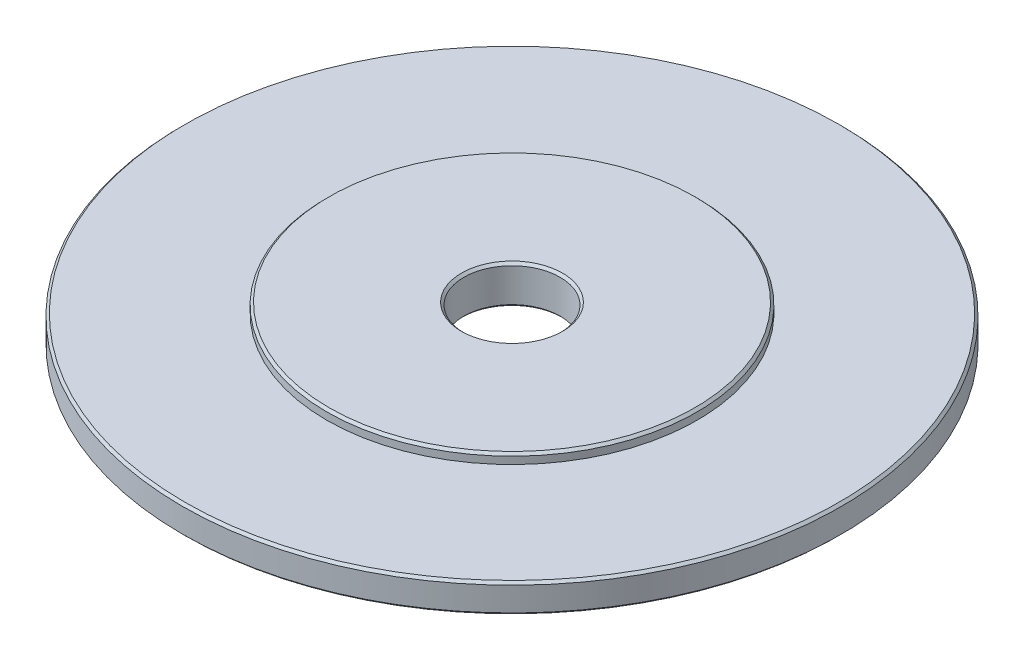
ISO-10303-21;
HEADER;
FILE_DESCRIPTION(('STEP AP214'),'2;1');
FILE_NAME('part.step','',(''),(''),'','','');
FILE_SCHEMA(('AUTOMOTIVE_DESIGN { 1 0 10303 214 1 1 1 1 }'));
ENDSEC;
DATA;
#1=APPLICATION_CONTEXT('core data for automotive mechanical design processes');
#2=APPLICATION_PROTOCOL_DEFINITION('international standard','automotive_design',2000,#1);
#3=PRODUCT_CONTEXT('',#1,'mechanical');
#4=PRODUCT('Part','Part','',(#3));
#5=PRODUCT_RELATED_PRODUCT_CATEGORY('part','',(#4));
#6=PRODUCT_DEFINITION_FORMATION('','',#4);
#7=PRODUCT_DEFINITION_CONTEXT('part definition',#1,'design');
#8=PRODUCT_DEFINITION('design','',#6,#7);
#9=PRODUCT_DEFINITION_SHAPE('','',#8);
#10=(LENGTH_UNIT() NAMED_UNIT(*) SI_UNIT(.MILLI.,.METRE.));
#11=(NAMED_UNIT(*) PLANE_ANGLE_UNIT() SI_UNIT($,.RADIAN.));
#12=(NAMED_UNIT(*) SI_UNIT($,.STERADIAN.) SOLID_ANGLE_UNIT());
#13=UNCERTAINTY_MEASURE_WITH_UNIT(LENGTH_MEASURE(1.E-05),#10,'distance_accuracy_value','');
#14=(GEOMETRIC_REPRESENTATION_CONTEXT(3) GLOBAL_UNCERTAINTY_ASSIGNED_CONTEXT((#13)) GLOBAL_UNIT_ASSIGNED_CONTEXT((#10,
#11,#12)) REPRESENTATION_CONTEXT('',''));
#15=CARTESIAN_POINT('',(0.,0.,0.));
#16=DIRECTION('',(0.,0.,1.));
#17=DIRECTION('',(1.,0.,0.));
#18=AXIS2_PLACEMENT_3D('',#15,#16,#17);
#19=CARTESIAN_POINT('',(0.,0.,0.));
#20=DIRECTION('',(0.,-1.,0.));
#21=DIRECTION('',(0.,0.,-1.));
#22=AXIS2_PLACEMENT_3D('',#19,#20,#21);
#23=CYLINDRICAL_SURFACE('',#22,68.5);
#24=CARTESIAN_POINT('',(0.,0.500000000000014,0.));
#25=DIRECTION('',(0.,-1.,0.));
#26=DIRECTION('',(0.,0.,-1.));
#27=AXIS2_PLACEMENT_3D('',#24,#25,#26);
#28=CIRCLE('',#27,68.5);
#29=CARTESIAN_POINT('',(0.,0.500000000000014,-68.5));
#30=VERTEX_POINT('',#29);
#31=EDGE_CURVE('E58',#30,#30,#28,.F.);
#32=ORIENTED_EDGE('',*,*,#31,.T.);
#33=EDGE_LOOP('',(#32));
#34=FACE_BOUND('',#33,.T.);
#35=CARTESIAN_POINT('',(0.,5.49999999999999,0.));
#36=DIRECTION('',(0.,1.,0.));
#37=DIRECTION('',(0.,0.,1.));
#38=AXIS2_PLACEMENT_3D('',#35,#36,#37);
#39=CIRCLE('',#38,68.5);
#40=CARTESIAN_POINT('',(0.,5.49999999999999,68.5));
#41=VERTEX_POINT('',#40);
#42=EDGE_CURVE('E61',#41,#41,#39,.F.);
#43=ORIENTED_EDGE('',*,*,#42,.T.);
#44=EDGE_LOOP('',(#43));
#45=FACE_BOUND('',#44,.T.);
#46=ADVANCED_FACE('F32',(#34,#45),#23,.T.);
#47=CARTESIAN_POINT('',(0.,5.99999999999999,-68.5));
#48=DIRECTION('',(0.,1.,0.));
#49=DIRECTION('',(0.,0.,1.));
#50=AXIS2_PLACEMENT_3D('',#47,#48,#49);
#51=PLANE('',#50);
#52=CARTESIAN_POINT('',(0.,5.99999999999999,0.));
#53=DIRECTION('',(0.,1.,0.));
#54=DIRECTION('',(0.,0.,1.));
#55=AXIS2_PLACEMENT_3D('',#52,#53,#54);
#56=CIRCLE('',#55,68.);
#57=CARTESIAN_POINT('',(0.,5.99999999999999,68.));
#58=VERTEX_POINT('',#57);
#59=EDGE_CURVE('E55',#58,#58,#56,.T.);
#60=ORIENTED_EDGE('',*,*,#59,.T.);
#61=EDGE_LOOP('',(#60));
#62=FACE_BOUND('',#61,.T.);
#63=CARTESIAN_POINT('',(0.,6.,0.));
#64=DIRECTION('',(0.,-1.,0.));
#65=DIRECTION('',(0.,0.,-1.));
#66=AXIS2_PLACEMENT_3D('',#63,#64,#65);
#67=CIRCLE('',#66,38.5);
#68=CARTESIAN_POINT('',(0.,6.,-38.5));
#69=VERTEX_POINT('',#68);
#70=EDGE_CURVE('E70',#69,#69,#67,.T.);
#71=ORIENTED_EDGE('',*,*,#70,.T.);
#72=EDGE_LOOP('',(#71));
#73=FACE_BOUND('',#72,.T.);
#74=ADVANCED_FACE('F74',(#62,#73),#51,.T.);
#75=CARTESIAN_POINT('',(0.,0.,0.));
#76=DIRECTION('',(0.,-1.,0.));
#77=DIRECTION('',(0.,0.,-1.));
#78=AXIS2_PLACEMENT_3D('',#75,#76,#77);
#79=CYLINDRICAL_SURFACE('',#78,38.5);
#80=CARTESIAN_POINT('',(0.,7.49999999999999,0.));
#81=DIRECTION('',(0.,1.,0.));
#82=DIRECTION('',(0.,0.,1.));
#83=AXIS2_PLACEMENT_3D('',#80,#81,#82);
#84=CIRCLE('',#83,38.5);
#85=CARTESIAN_POINT('',(0.,7.49999999999999,38.5));
#86=VERTEX_POINT('',#85);
#87=EDGE_CURVE('E10',#86,#86,#84,.F.);
#88=ORIENTED_EDGE('',*,*,#87,.T.);
#89=EDGE_LOOP('',(#88));
#90=FACE_BOUND('',#89,.T.);
#91=ORIENTED_EDGE('',*,*,#70,.F.);
#92=EDGE_LOOP('',(#91));
#93=FACE_BOUND('',#92,.T.);
#94=ADVANCED_FACE('F76',(#90,#93),#79,.T.);
#95=CARTESIAN_POINT('',(0.,7.99999999999999,-38.5));
#96=DIRECTION('',(0.,1.,0.));
#97=DIRECTION('',(0.,0.,1.));
#98=AXIS2_PLACEMENT_3D('',#95,#96,#97);
#99=PLANE('',#98);
#100=CARTESIAN_POINT('',(0.,7.99999999999999,0.));
#101=DIRECTION('',(0.,1.,0.));
#102=DIRECTION('',(0.,0.,1.));
#103=AXIS2_PLACEMENT_3D('',#100,#101,#102);
#104=CIRCLE('',#103,10.5);
#105=CARTESIAN_POINT('',(0.,7.99999999999999,10.5));
#106=VERTEX_POINT('',#105);
#107=EDGE_CURVE('E47',#106,#106,#104,.F.);
#108=ORIENTED_EDGE('',*,*,#107,.T.);
#109=EDGE_LOOP('',(#108));
#110=FACE_BOUND('',#109,.T.);
#111=CARTESIAN_POINT('',(0.,7.99999999999999,0.));
#112=DIRECTION('',(0.,1.,0.));
#113=DIRECTION('',(0.,0.,1.));
#114=AXIS2_PLACEMENT_3D('',#111,#112,#113);
#115=CIRCLE('',#114,38.);
#116=CARTESIAN_POINT('',(0.,7.99999999999999,38.));
#117=VERTEX_POINT('',#116);
#118=EDGE_CURVE('E52',#117,#117,#115,.T.);
#119=ORIENTED_EDGE('',*,*,#118,.T.);
#120=EDGE_LOOP('',(#119));
#121=FACE_BOUND('',#120,.T.);
#122=ADVANCED_FACE('F78',(#110,#121),#99,.T.);
#123=CARTESIAN_POINT('',(0.,0.,0.));
#124=DIRECTION('',(0.,-1.,0.));
#125=DIRECTION('',(0.,0.,-1.));
#126=AXIS2_PLACEMENT_3D('',#123,#124,#125);
#127=CYLINDRICAL_SURFACE('',#126,10.);
#128=CARTESIAN_POINT('',(0.,7.49999999999996,0.));
#129=DIRECTION('',(0.,1.,0.));
#130=DIRECTION('',(0.,0.,1.));
#131=AXIS2_PLACEMENT_3D('',#128,#129,#130);
#132=CIRCLE('',#131,10.);
#133=CARTESIAN_POINT('',(0.,7.49999999999996,10.));
#134=VERTEX_POINT('',#133);
#135=EDGE_CURVE('E39',#134,#134,#132,.T.);
#136=ORIENTED_EDGE('',*,*,#135,.T.);
#137=EDGE_LOOP('',(#136));
#138=FACE_BOUND('',#137,.T.);
#139=CARTESIAN_POINT('',(0.,0.49999999999999,0.));
#140=DIRECTION('',(0.,-1.,0.));
#141=DIRECTION('',(0.,0.,-1.));
#142=AXIS2_PLACEMENT_3D('',#139,#140,#141);
#143=CIRCLE('',#142,10.);
#144=CARTESIAN_POINT('',(0.,0.49999999999999,-10.));
#145=VERTEX_POINT('',#144);
#146=EDGE_CURVE('E43',#145,#145,#143,.T.);
#147=ORIENTED_EDGE('',*,*,#146,.T.);
#148=EDGE_LOOP('',(#147));
#149=FACE_BOUND('',#148,.T.);
#150=ADVANCED_FACE('F84',(#138,#149),#127,.F.);
#151=CARTESIAN_POINT('',(0.,0.,-10.));
#152=DIRECTION('',(0.,-1.,0.));
#153=DIRECTION('',(0.,0.,-1.));
#154=AXIS2_PLACEMENT_3D('',#151,#152,#153);
#155=PLANE('',#154);
#156=CARTESIAN_POINT('',(0.,0.,0.));
#157=DIRECTION('',(0.,-1.,0.));
#158=DIRECTION('',(0.,0.,-1.));
#159=AXIS2_PLACEMENT_3D('',#156,#157,#158);
#160=CIRCLE('',#159,68.);
#161=CARTESIAN_POINT('',(0.,0.,-68.));
#162=VERTEX_POINT('',#161);
#163=EDGE_CURVE('E64',#162,#162,#160,.T.);
#164=ORIENTED_EDGE('',*,*,#163,.T.);
#165=EDGE_LOOP('',(#164));
#166=FACE_BOUND('',#165,.T.);
#167=CARTESIAN_POINT('',(0.,0.,0.));
#168=DIRECTION('',(0.,-1.,0.));
#169=DIRECTION('',(0.,0.,-1.));
#170=AXIS2_PLACEMENT_3D('',#167,#168,#169);
#171=CIRCLE('',#170,10.5);
#172=CARTESIAN_POINT('',(0.,0.,-10.5));
#173=VERTEX_POINT('',#172);
#174=EDGE_CURVE('E67',#173,#173,#171,.F.);
#175=ORIENTED_EDGE('',*,*,#174,.T.);
#176=EDGE_LOOP('',(#175));
#177=FACE_BOUND('',#176,.T.);
#178=ADVANCED_FACE('F100',(#166,#177),#155,.T.);
#179=CARTESIAN_POINT('',(0.,0.,0.));
#180=DIRECTION('',(0.,1.,0.));
#181=DIRECTION('',(0.,0.,1.));
#182=AXIS2_PLACEMENT_3D('',#179,#180,#181);
#183=CONICAL_SURFACE('',#182,68.,0.785398163397435);
#184=ORIENTED_EDGE('',*,*,#31,.F.);
#185=EDGE_LOOP('',(#184));
#186=FACE_BOUND('',#185,.T.);
#187=ORIENTED_EDGE('',*,*,#163,.F.);
#188=EDGE_LOOP('',(#187));
#189=FACE_BOUND('',#188,.T.);
#190=ADVANCED_FACE('F96',(#186,#189),#183,.T.);
#191=CARTESIAN_POINT('',(0.,5.49999999999999,0.));
#192=DIRECTION('',(0.,-1.,0.));
#193=DIRECTION('',(0.,0.,-1.));
#194=AXIS2_PLACEMENT_3D('',#191,#192,#193);
#195=CONICAL_SURFACE('',#194,68.5,0.785398163397448);
#196=ORIENTED_EDGE('',*,*,#59,.F.);
#197=EDGE_LOOP('',(#196));
#198=FACE_BOUND('',#197,.T.);
#199=ORIENTED_EDGE('',*,*,#42,.F.);
#200=EDGE_LOOP('',(#199));
#201=FACE_BOUND('',#200,.T.);
#202=ADVANCED_FACE('F99',(#198,#201),#195,.T.);
#203=CARTESIAN_POINT('',(0.,7.99999999999999,0.));
#204=DIRECTION('',(0.,1.,0.));
#205=DIRECTION('',(0.,0.,1.));
#206=AXIS2_PLACEMENT_3D('',#203,#204,#205);
#207=CONICAL_SURFACE('',#206,10.5,0.785398163397455);
#208=ORIENTED_EDGE('',*,*,#135,.F.);
#209=EDGE_LOOP('',(#208));
#210=FACE_BOUND('',#209,.T.);
#211=ORIENTED_EDGE('',*,*,#107,.F.);
#212=EDGE_LOOP('',(#211));
#213=FACE_BOUND('',#212,.T.);
#214=ADVANCED_FACE('F104',(#210,#213),#207,.F.);
#215=CARTESIAN_POINT('',(0.,0.49999999999999,0.));
#216=DIRECTION('',(0.,-1.,0.));
#217=DIRECTION('',(0.,0.,-1.));
#218=AXIS2_PLACEMENT_3D('',#215,#216,#217);
#219=CONICAL_SURFACE('',#218,10.,0.785398163397469);
#220=ORIENTED_EDGE('',*,*,#174,.F.);
#221=EDGE_LOOP('',(#220));
#222=FACE_BOUND('',#221,.T.);
#223=ORIENTED_EDGE('',*,*,#146,.F.);
#224=EDGE_LOOP('',(#223));
#225=FACE_BOUND('',#224,.T.);
#226=ADVANCED_FACE('F107',(#222,#225),#219,.F.);
#227=CARTESIAN_POINT('',(0.,7.49999999999999,0.));
#228=DIRECTION('',(0.,-1.,0.));
#229=DIRECTION('',(0.,0.,-1.));
#230=AXIS2_PLACEMENT_3D('',#227,#228,#229);
#231=CONICAL_SURFACE('',#230,38.5,0.785398163397448);
#232=ORIENTED_EDGE('',*,*,#118,.F.);
#233=EDGE_LOOP('',(#232));
#234=FACE_BOUND('',#233,.T.);
#235=ORIENTED_EDGE('',*,*,#87,.F.);
#236=EDGE_LOOP('',(#235));
#237=FACE_BOUND('',#236,.T.);
#238=ADVANCED_FACE('F34',(#234,#237),#231,.T.);
#239=CLOSED_SHELL('',(#46,#74,#94,#122,#150,#178,#190,#202,#214,#226,#238));
#240=MANIFOLD_SOLID_BREP('B2',#239);
#241=ADVANCED_BREP_SHAPE_REPRESENTATION('',(#18,#240),#14);
#242=SHAPE_DEFINITION_REPRESENTATION(#9,#241);
ENDSEC;
END-ISO-10303-21;
